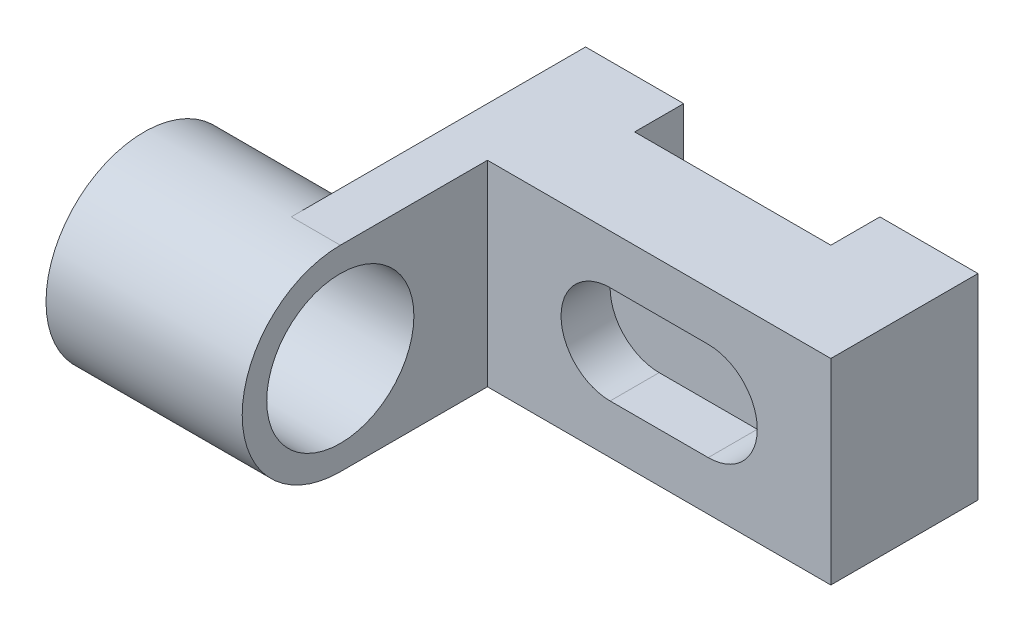
ISO-10303-21;
HEADER;
FILE_DESCRIPTION(('STEP AP214'),'2;1');
FILE_NAME('part.step','',(''),(''),'','','');
FILE_SCHEMA(('AUTOMOTIVE_DESIGN { 1 0 10303 214 1 1 1 1 }'));
ENDSEC;
DATA;
#1=APPLICATION_CONTEXT('core data for automotive mechanical design processes');
#2=APPLICATION_PROTOCOL_DEFINITION('international standard','automotive_design',2000,#1);
#3=PRODUCT_CONTEXT('',#1,'mechanical');
#4=PRODUCT('Part','Part','',(#3));
#5=PRODUCT_RELATED_PRODUCT_CATEGORY('part','',(#4));
#6=PRODUCT_DEFINITION_FORMATION('','',#4);
#7=PRODUCT_DEFINITION_CONTEXT('part definition',#1,'design');
#8=PRODUCT_DEFINITION('design','',#6,#7);
#9=PRODUCT_DEFINITION_SHAPE('','',#8);
#10=(LENGTH_UNIT() NAMED_UNIT(*) SI_UNIT(.MILLI.,.METRE.));
#11=(NAMED_UNIT(*) PLANE_ANGLE_UNIT() SI_UNIT($,.RADIAN.));
#12=(NAMED_UNIT(*) SI_UNIT($,.STERADIAN.) SOLID_ANGLE_UNIT());
#13=UNCERTAINTY_MEASURE_WITH_UNIT(LENGTH_MEASURE(1.E-05),#10,'distance_accuracy_value','');
#14=(GEOMETRIC_REPRESENTATION_CONTEXT(3) GLOBAL_UNCERTAINTY_ASSIGNED_CONTEXT((#13)) GLOBAL_UNIT_ASSIGNED_CONTEXT((#10,
#11,#12)) REPRESENTATION_CONTEXT('',''));
#15=CARTESIAN_POINT('',(0.,0.,0.));
#16=DIRECTION('',(0.,0.,1.));
#17=DIRECTION('',(1.,0.,0.));
#18=AXIS2_PLACEMENT_3D('',#15,#16,#17);
#19=CARTESIAN_POINT('',(-40.,20.,30.));
#20=DIRECTION('',(1.,0.,0.));
#21=DIRECTION('',(0.,0.,-1.));
#22=AXIS2_PLACEMENT_3D('',#19,#20,#21);
#23=PLANE('',#22);
#24=CARTESIAN_POINT('',(-40.,0.,60.));
#25=DIRECTION('',(-1.,0.,0.));
#26=DIRECTION('',(0.,0.,1.));
#27=AXIS2_PLACEMENT_3D('',#24,#25,#26);
#28=CIRCLE('',#27,20.);
#29=CARTESIAN_POINT('',(-40.,20.,60.));
#30=VERTEX_POINT('',#29);
#31=CARTESIAN_POINT('',(-40.,-20.,60.));
#32=VERTEX_POINT('',#31);
#33=EDGE_CURVE('E139',#30,#32,#28,.T.);
#34=ORIENTED_EDGE('',*,*,#33,.F.);
#35=DIRECTION('',(0.,0.,-1.));
#36=VECTOR('',#35,1.);
#37=CARTESIAN_POINT('',(-40.,20.,30.));
#38=LINE('',#37,#36);
#39=CARTESIAN_POINT('',(-40.,20.,0.));
#40=VERTEX_POINT('',#39);
#41=EDGE_CURVE('E147',#30,#40,#38,.T.);
#42=ORIENTED_EDGE('',*,*,#41,.T.);
#43=DIRECTION('',(0.,-1.,0.));
#44=VECTOR('',#43,1.);
#45=CARTESIAN_POINT('',(-40.,20.,0.));
#46=LINE('',#45,#44);
#47=CARTESIAN_POINT('',(-40.,-20.,0.));
#48=VERTEX_POINT('',#47);
#49=EDGE_CURVE('E246',#40,#48,#46,.T.);
#50=ORIENTED_EDGE('',*,*,#49,.T.);
#51=DIRECTION('',(0.,0.,-1.));
#52=VECTOR('',#51,1.);
#53=CARTESIAN_POINT('',(-40.,-20.,30.));
#54=LINE('',#53,#52);
#55=EDGE_CURVE('E157',#32,#48,#54,.T.);
#56=ORIENTED_EDGE('',*,*,#55,.F.);
#57=EDGE_LOOP('',(#34,#42,#50,#56));
#58=FACE_BOUND('',#57,.T.);
#59=ADVANCED_FACE('F33',(#58),#23,.F.);
#60=CARTESIAN_POINT('',(0.,0.,0.));
#61=DIRECTION('',(0.,0.,-1.));
#62=DIRECTION('',(-1.,0.,0.));
#63=AXIS2_PLACEMENT_3D('',#60,#61,#62);
#64=PLANE('',#63);
#65=DIRECTION('',(0.,1.,0.));
#66=VECTOR('',#65,1.);
#67=CARTESIAN_POINT('',(-20.,0.,0.));
#68=LINE('',#67,#66);
#69=CARTESIAN_POINT('',(-20.,-20.,0.));
#70=VERTEX_POINT('',#69);
#71=CARTESIAN_POINT('',(-20.,20.,0.));
#72=VERTEX_POINT('',#71);
#73=EDGE_CURVE('E11',#70,#72,#68,.T.);
#74=ORIENTED_EDGE('',*,*,#73,.F.);
#75=DIRECTION('',(-1.,0.,0.));
#76=VECTOR('',#75,1.);
#77=CARTESIAN_POINT('',(40.,-20.,0.));
#78=LINE('',#77,#76);
#79=EDGE_CURVE('E242',#70,#48,#78,.T.);
#80=ORIENTED_EDGE('',*,*,#79,.T.);
#81=ORIENTED_EDGE('',*,*,#49,.F.);
#82=DIRECTION('',(-1.,0.,0.));
#83=VECTOR('',#82,1.);
#84=CARTESIAN_POINT('',(40.,20.,0.));
#85=LINE('',#84,#83);
#86=EDGE_CURVE('E152',#72,#40,#85,.T.);
#87=ORIENTED_EDGE('',*,*,#86,.F.);
#88=EDGE_LOOP('',(#74,#80,#81,#87));
#89=FACE_BOUND('',#88,.T.);
#90=ADVANCED_FACE('F281',(#89),#64,.T.);
#91=CARTESIAN_POINT('',(40.,20.,30.));
#92=DIRECTION('',(1.,0.,0.));
#93=DIRECTION('',(0.,0.,-1.));
#94=AXIS2_PLACEMENT_3D('',#91,#92,#93);
#95=PLANE('',#94);
#96=DIRECTION('',(0.,-1.,0.));
#97=VECTOR('',#96,1.);
#98=CARTESIAN_POINT('',(40.,20.,0.));
#99=LINE('',#98,#97);
#100=CARTESIAN_POINT('',(40.,20.,0.));
#101=VERTEX_POINT('',#100);
#102=CARTESIAN_POINT('',(40.,-20.,0.));
#103=VERTEX_POINT('',#102);
#104=EDGE_CURVE('E226',#101,#103,#99,.T.);
#105=ORIENTED_EDGE('',*,*,#104,.F.);
#106=DIRECTION('',(0.,0.,-1.));
#107=VECTOR('',#106,1.);
#108=CARTESIAN_POINT('',(40.,20.,30.));
#109=LINE('',#108,#107);
#110=CARTESIAN_POINT('',(40.,20.,30.));
#111=VERTEX_POINT('',#110);
#112=EDGE_CURVE('E156',#111,#101,#109,.T.);
#113=ORIENTED_EDGE('',*,*,#112,.F.);
#114=DIRECTION('',(0.,-1.,0.));
#115=VECTOR('',#114,1.);
#116=CARTESIAN_POINT('',(40.,20.,30.));
#117=LINE('',#116,#115);
#118=CARTESIAN_POINT('',(40.,-20.,30.));
#119=VERTEX_POINT('',#118);
#120=EDGE_CURVE('E229',#111,#119,#117,.T.);
#121=ORIENTED_EDGE('',*,*,#120,.T.);
#122=DIRECTION('',(0.,0.,-1.));
#123=VECTOR('',#122,1.);
#124=CARTESIAN_POINT('',(40.,-20.,30.));
#125=LINE('',#124,#123);
#126=EDGE_CURVE('E239',#119,#103,#125,.T.);
#127=ORIENTED_EDGE('',*,*,#126,.T.);
#128=EDGE_LOOP('',(#105,#113,#121,#127));
#129=FACE_BOUND('',#128,.T.);
#130=ADVANCED_FACE('F35',(#129),#95,.T.);
#131=CARTESIAN_POINT('',(40.,20.,30.));
#132=DIRECTION('',(0.,-1.,0.));
#133=DIRECTION('',(1.,0.,0.));
#134=AXIS2_PLACEMENT_3D('',#131,#132,#133);
#135=PLANE('',#134);
#136=DIRECTION('',(-1.,0.,0.));
#137=VECTOR('',#136,1.);
#138=CARTESIAN_POINT('',(20.,20.,10.));
#139=LINE('',#138,#137);
#140=CARTESIAN_POINT('',(20.,20.,10.));
#141=VERTEX_POINT('',#140);
#142=CARTESIAN_POINT('',(-20.,20.,9.99999999999999));
#143=VERTEX_POINT('',#142);
#144=EDGE_CURVE('E216',#141,#143,#139,.T.);
#145=ORIENTED_EDGE('',*,*,#144,.T.);
#146=DIRECTION('',(0.,0.,-1.));
#147=VECTOR('',#146,1.);
#148=CARTESIAN_POINT('',(-20.,20.,9.99999999999999));
#149=LINE('',#148,#147);
#150=EDGE_CURVE('E210',#143,#72,#149,.T.);
#151=ORIENTED_EDGE('',*,*,#150,.T.);
#152=ORIENTED_EDGE('',*,*,#86,.T.);
#153=ORIENTED_EDGE('',*,*,#41,.F.);
#154=DIRECTION('',(-1.,0.,0.));
#155=VECTOR('',#154,1.);
#156=CARTESIAN_POINT('',(-30.,20.,60.));
#157=LINE('',#156,#155);
#158=CARTESIAN_POINT('',(-30.,20.,60.));
#159=VERTEX_POINT('',#158);
#160=EDGE_CURVE('E134',#159,#30,#157,.T.);
#161=ORIENTED_EDGE('',*,*,#160,.F.);
#162=DIRECTION('',(0.,0.,-1.));
#163=VECTOR('',#162,1.);
#164=CARTESIAN_POINT('',(-30.,20.,30.));
#165=LINE('',#164,#163);
#166=CARTESIAN_POINT('',(-30.,20.,30.));
#167=VERTEX_POINT('',#166);
#168=EDGE_CURVE('E176',#159,#167,#165,.T.);
#169=ORIENTED_EDGE('',*,*,#168,.T.);
#170=DIRECTION('',(-1.,0.,0.));
#171=VECTOR('',#170,1.);
#172=CARTESIAN_POINT('',(40.,20.,30.));
#173=LINE('',#172,#171);
#174=EDGE_CURVE('E236',#111,#167,#173,.T.);
#175=ORIENTED_EDGE('',*,*,#174,.F.);
#176=ORIENTED_EDGE('',*,*,#112,.T.);
#177=CARTESIAN_POINT('',(20.,20.,0.));
#178=VERTEX_POINT('',#177);
#179=EDGE_CURVE('E233',#101,#178,#85,.T.);
#180=ORIENTED_EDGE('',*,*,#179,.T.);
#181=DIRECTION('',(0.,0.,1.));
#182=VECTOR('',#181,1.);
#183=CARTESIAN_POINT('',(20.,20.,10.));
#184=LINE('',#183,#182);
#185=EDGE_CURVE('E212',#178,#141,#184,.T.);
#186=ORIENTED_EDGE('',*,*,#185,.T.);
#187=EDGE_LOOP('',(#145,#151,#152,#153,#161,#169,#175,#176,#180,#186));
#188=FACE_BOUND('',#187,.T.);
#189=ADVANCED_FACE('F149',(#188),#135,.F.);
#190=CARTESIAN_POINT('',(40.,-20.,30.));
#191=DIRECTION('',(0.,-1.,0.));
#192=DIRECTION('',(1.,0.,0.));
#193=AXIS2_PLACEMENT_3D('',#190,#191,#192);
#194=PLANE('',#193);
#195=DIRECTION('',(0.,0.,-1.));
#196=VECTOR('',#195,1.);
#197=CARTESIAN_POINT('',(-20.,-20.,9.99999999999999));
#198=LINE('',#197,#196);
#199=CARTESIAN_POINT('',(-20.,-20.,9.99999999999999));
#200=VERTEX_POINT('',#199);
#201=EDGE_CURVE('E204',#200,#70,#198,.T.);
#202=ORIENTED_EDGE('',*,*,#201,.F.);
#203=DIRECTION('',(-1.,0.,0.));
#204=VECTOR('',#203,1.);
#205=CARTESIAN_POINT('',(20.,-20.,10.));
#206=LINE('',#205,#204);
#207=CARTESIAN_POINT('',(20.,-20.,10.));
#208=VERTEX_POINT('',#207);
#209=EDGE_CURVE('E213',#208,#200,#206,.T.);
#210=ORIENTED_EDGE('',*,*,#209,.F.);
#211=DIRECTION('',(0.,0.,1.));
#212=VECTOR('',#211,1.);
#213=CARTESIAN_POINT('',(20.,-20.,10.));
#214=LINE('',#213,#212);
#215=CARTESIAN_POINT('',(20.,-20.,0.));
#216=VERTEX_POINT('',#215);
#217=EDGE_CURVE('E220',#216,#208,#214,.T.);
#218=ORIENTED_EDGE('',*,*,#217,.F.);
#219=EDGE_CURVE('E243',#103,#216,#78,.T.);
#220=ORIENTED_EDGE('',*,*,#219,.F.);
#221=ORIENTED_EDGE('',*,*,#126,.F.);
#222=DIRECTION('',(-1.,0.,0.));
#223=VECTOR('',#222,1.);
#224=CARTESIAN_POINT('',(40.,-20.,30.));
#225=LINE('',#224,#223);
#226=CARTESIAN_POINT('',(-30.,-20.,30.));
#227=VERTEX_POINT('',#226);
#228=EDGE_CURVE('E232',#119,#227,#225,.T.);
#229=ORIENTED_EDGE('',*,*,#228,.T.);
#230=DIRECTION('',(0.,0.,1.));
#231=VECTOR('',#230,1.);
#232=CARTESIAN_POINT('',(-30.,-20.,30.));
#233=LINE('',#232,#231);
#234=CARTESIAN_POINT('',(-30.,-20.,60.));
#235=VERTEX_POINT('',#234);
#236=EDGE_CURVE('E48',#227,#235,#233,.T.);
#237=ORIENTED_EDGE('',*,*,#236,.T.);
#238=DIRECTION('',(-1.,0.,0.));
#239=VECTOR('',#238,1.);
#240=CARTESIAN_POINT('',(-30.,-20.,60.));
#241=LINE('',#240,#239);
#242=EDGE_CURVE('E144',#235,#32,#241,.T.);
#243=ORIENTED_EDGE('',*,*,#242,.T.);
#244=ORIENTED_EDGE('',*,*,#55,.T.);
#245=ORIENTED_EDGE('',*,*,#79,.F.);
#246=EDGE_LOOP('',(#202,#210,#218,#220,#221,#229,#237,#243,#244,#245));
#247=FACE_BOUND('',#246,.T.);
#248=ADVANCED_FACE('F262',(#247),#194,.T.);
#249=CARTESIAN_POINT('',(0.,0.,30.));
#250=DIRECTION('',(0.,0.,-1.));
#251=DIRECTION('',(-1.,0.,0.));
#252=AXIS2_PLACEMENT_3D('',#249,#250,#251);
#253=PLANE('',#252);
#254=DIRECTION('',(-1.,0.,0.));
#255=VECTOR('',#254,1.);
#256=CARTESIAN_POINT('',(15.,10.,30.));
#257=LINE('',#256,#255);
#258=CARTESIAN_POINT('',(15.,10.,30.));
#259=VERTEX_POINT('',#258);
#260=CARTESIAN_POINT('',(-5.,10.,30.));
#261=VERTEX_POINT('',#260);
#262=EDGE_CURVE('E194',#259,#261,#257,.T.);
#263=ORIENTED_EDGE('',*,*,#262,.F.);
#264=CARTESIAN_POINT('',(15.,0.,30.));
#265=DIRECTION('',(0.,0.,1.));
#266=DIRECTION('',(1.,0.,0.));
#267=AXIS2_PLACEMENT_3D('',#264,#265,#266);
#268=CIRCLE('',#267,10.);
#269=CARTESIAN_POINT('',(15.,-10.,30.));
#270=VERTEX_POINT('',#269);
#271=EDGE_CURVE('E56',#270,#259,#268,.T.);
#272=ORIENTED_EDGE('',*,*,#271,.F.);
#273=DIRECTION('',(1.,0.,0.));
#274=VECTOR('',#273,1.);
#275=CARTESIAN_POINT('',(15.,-10.,30.));
#276=LINE('',#275,#274);
#277=CARTESIAN_POINT('',(-5.,-10.,30.));
#278=VERTEX_POINT('',#277);
#279=EDGE_CURVE('E183',#278,#270,#276,.T.);
#280=ORIENTED_EDGE('',*,*,#279,.F.);
#281=CARTESIAN_POINT('',(-5.,0.,30.));
#282=DIRECTION('',(0.,0.,1.));
#283=DIRECTION('',(1.,0.,0.));
#284=AXIS2_PLACEMENT_3D('',#281,#282,#283);
#285=CIRCLE('',#284,10.);
#286=EDGE_CURVE('E197',#261,#278,#285,.T.);
#287=ORIENTED_EDGE('',*,*,#286,.F.);
#288=EDGE_LOOP('',(#263,#272,#280,#287));
#289=FACE_BOUND('',#288,.T.);
#290=ORIENTED_EDGE('',*,*,#174,.T.);
#291=DIRECTION('',(0.,-1.,0.));
#292=VECTOR('',#291,1.);
#293=CARTESIAN_POINT('',(-30.,-20.,30.));
#294=LINE('',#293,#292);
#295=EDGE_CURVE('E172',#167,#227,#294,.T.);
#296=ORIENTED_EDGE('',*,*,#295,.T.);
#297=ORIENTED_EDGE('',*,*,#228,.F.);
#298=ORIENTED_EDGE('',*,*,#120,.F.);
#299=EDGE_LOOP('',(#290,#296,#297,#298));
#300=FACE_BOUND('',#299,.T.);
#301=ADVANCED_FACE('F270',(#289,#300),#253,.F.);
#302=DIRECTION('',(0.,-1.,0.));
#303=VECTOR('',#302,1.);
#304=CARTESIAN_POINT('',(20.,0.,0.));
#305=LINE('',#304,#303);
#306=EDGE_CURVE('E41',#178,#216,#305,.T.);
#307=ORIENTED_EDGE('',*,*,#306,.F.);
#308=ORIENTED_EDGE('',*,*,#179,.F.);
#309=ORIENTED_EDGE('',*,*,#104,.T.);
#310=ORIENTED_EDGE('',*,*,#219,.T.);
#311=EDGE_LOOP('',(#307,#308,#309,#310));
#312=FACE_BOUND('',#311,.T.);
#313=ADVANCED_FACE('F263',(#312),#64,.T.);
#314=CARTESIAN_POINT('',(-20.,20.,9.99999999999999));
#315=DIRECTION('',(-1.,0.,0.));
#316=DIRECTION('',(0.,0.,1.));
#317=AXIS2_PLACEMENT_3D('',#314,#315,#316);
#318=PLANE('',#317);
#319=ORIENTED_EDGE('',*,*,#73,.T.);
#320=ORIENTED_EDGE('',*,*,#150,.F.);
#321=DIRECTION('',(0.,-1.,0.));
#322=VECTOR('',#321,1.);
#323=CARTESIAN_POINT('',(-20.,20.,9.99999999999999));
#324=LINE('',#323,#322);
#325=EDGE_CURVE('E224',#143,#200,#324,.T.);
#326=ORIENTED_EDGE('',*,*,#325,.T.);
#327=ORIENTED_EDGE('',*,*,#201,.T.);
#328=EDGE_LOOP('',(#319,#320,#326,#327));
#329=FACE_BOUND('',#328,.T.);
#330=ADVANCED_FACE('F277',(#329),#318,.F.);
#331=CARTESIAN_POINT('',(20.,20.,10.));
#332=DIRECTION('',(0.,0.,1.));
#333=DIRECTION('',(1.,0.,0.));
#334=AXIS2_PLACEMENT_3D('',#331,#332,#333);
#335=PLANE('',#334);
#336=ORIENTED_EDGE('',*,*,#209,.T.);
#337=ORIENTED_EDGE('',*,*,#325,.F.);
#338=ORIENTED_EDGE('',*,*,#144,.F.);
#339=DIRECTION('',(0.,-1.,0.));
#340=VECTOR('',#339,1.);
#341=CARTESIAN_POINT('',(20.,20.,10.));
#342=LINE('',#341,#340);
#343=EDGE_CURVE('E218',#141,#208,#342,.T.);
#344=ORIENTED_EDGE('',*,*,#343,.T.);
#345=EDGE_LOOP('',(#336,#337,#338,#344));
#346=FACE_BOUND('',#345,.T.);
#347=ADVANCED_FACE('F275',(#346),#335,.F.);
#348=CARTESIAN_POINT('',(20.,20.,10.));
#349=DIRECTION('',(1.,0.,0.));
#350=DIRECTION('',(0.,0.,-1.));
#351=AXIS2_PLACEMENT_3D('',#348,#349,#350);
#352=PLANE('',#351);
#353=ORIENTED_EDGE('',*,*,#306,.T.);
#354=ORIENTED_EDGE('',*,*,#217,.T.);
#355=ORIENTED_EDGE('',*,*,#343,.F.);
#356=ORIENTED_EDGE('',*,*,#185,.F.);
#357=EDGE_LOOP('',(#353,#354,#355,#356));
#358=FACE_BOUND('',#357,.T.);
#359=ADVANCED_FACE('F255',(#358),#352,.F.);
#360=CARTESIAN_POINT('',(15.,0.,20.));
#361=DIRECTION('',(0.,0.,1.));
#362=DIRECTION('',(1.,0.,0.));
#363=AXIS2_PLACEMENT_3D('',#360,#361,#362);
#364=CYLINDRICAL_SURFACE('',#363,10.);
#365=ORIENTED_EDGE('',*,*,#271,.T.);
#366=DIRECTION('',(0.,0.,1.));
#367=VECTOR('',#366,1.);
#368=CARTESIAN_POINT('',(15.,10.,20.));
#369=LINE('',#368,#367);
#370=CARTESIAN_POINT('',(15.,10.,20.));
#371=VERTEX_POINT('',#370);
#372=EDGE_CURVE('E192',#371,#259,#369,.T.);
#373=ORIENTED_EDGE('',*,*,#372,.F.);
#374=CARTESIAN_POINT('',(15.,0.,20.));
#375=DIRECTION('',(0.,0.,1.));
#376=DIRECTION('',(1.,0.,0.));
#377=AXIS2_PLACEMENT_3D('',#374,#375,#376);
#378=CIRCLE('',#377,10.);
#379=CARTESIAN_POINT('',(15.,-10.,20.));
#380=VERTEX_POINT('',#379);
#381=EDGE_CURVE('E179',#380,#371,#378,.T.);
#382=ORIENTED_EDGE('',*,*,#381,.F.);
#383=DIRECTION('',(0.,0.,1.));
#384=VECTOR('',#383,1.);
#385=CARTESIAN_POINT('',(15.,-10.,20.));
#386=LINE('',#385,#384);
#387=EDGE_CURVE('E202',#380,#270,#386,.T.);
#388=ORIENTED_EDGE('',*,*,#387,.T.);
#389=EDGE_LOOP('',(#365,#373,#382,#388));
#390=FACE_BOUND('',#389,.T.);
#391=ADVANCED_FACE('F305',(#390),#364,.F.);
#392=CARTESIAN_POINT('',(15.,-10.,20.));
#393=DIRECTION('',(0.,-1.,0.));
#394=DIRECTION('',(0.,0.,-1.));
#395=AXIS2_PLACEMENT_3D('',#392,#393,#394);
#396=PLANE('',#395);
#397=ORIENTED_EDGE('',*,*,#279,.T.);
#398=ORIENTED_EDGE('',*,*,#387,.F.);
#399=DIRECTION('',(1.,0.,0.));
#400=VECTOR('',#399,1.);
#401=CARTESIAN_POINT('',(15.,-10.,20.));
#402=LINE('',#401,#400);
#403=CARTESIAN_POINT('',(-5.,-10.,20.));
#404=VERTEX_POINT('',#403);
#405=EDGE_CURVE('E189',#404,#380,#402,.T.);
#406=ORIENTED_EDGE('',*,*,#405,.F.);
#407=DIRECTION('',(0.,0.,1.));
#408=VECTOR('',#407,1.);
#409=CARTESIAN_POINT('',(-5.,-10.,20.));
#410=LINE('',#409,#408);
#411=EDGE_CURVE('E205',#404,#278,#410,.T.);
#412=ORIENTED_EDGE('',*,*,#411,.T.);
#413=EDGE_LOOP('',(#397,#398,#406,#412));
#414=FACE_BOUND('',#413,.T.);
#415=ADVANCED_FACE('F310',(#414),#396,.F.);
#416=CARTESIAN_POINT('',(-5.,0.,20.));
#417=DIRECTION('',(0.,0.,1.));
#418=DIRECTION('',(1.,0.,0.));
#419=AXIS2_PLACEMENT_3D('',#416,#417,#418);
#420=CYLINDRICAL_SURFACE('',#419,10.);
#421=ORIENTED_EDGE('',*,*,#286,.T.);
#422=ORIENTED_EDGE('',*,*,#411,.F.);
#423=CARTESIAN_POINT('',(-5.,0.,20.));
#424=DIRECTION('',(0.,0.,1.));
#425=DIRECTION('',(1.,0.,0.));
#426=AXIS2_PLACEMENT_3D('',#423,#424,#425);
#427=CIRCLE('',#426,10.);
#428=CARTESIAN_POINT('',(-5.,10.,20.));
#429=VERTEX_POINT('',#428);
#430=EDGE_CURVE('E186',#429,#404,#427,.T.);
#431=ORIENTED_EDGE('',*,*,#430,.F.);
#432=DIRECTION('',(0.,0.,1.));
#433=VECTOR('',#432,1.);
#434=CARTESIAN_POINT('',(-5.,10.,20.));
#435=LINE('',#434,#433);
#436=EDGE_CURVE('E207',#429,#261,#435,.T.);
#437=ORIENTED_EDGE('',*,*,#436,.T.);
#438=EDGE_LOOP('',(#421,#422,#431,#437));
#439=FACE_BOUND('',#438,.T.);
#440=ADVANCED_FACE('F315',(#439),#420,.F.);
#441=CARTESIAN_POINT('',(15.,10.,20.));
#442=DIRECTION('',(0.,1.,0.));
#443=DIRECTION('',(0.,0.,1.));
#444=AXIS2_PLACEMENT_3D('',#441,#442,#443);
#445=PLANE('',#444);
#446=ORIENTED_EDGE('',*,*,#262,.T.);
#447=ORIENTED_EDGE('',*,*,#436,.F.);
#448=DIRECTION('',(-1.,0.,0.));
#449=VECTOR('',#448,1.);
#450=CARTESIAN_POINT('',(15.,10.,20.));
#451=LINE('',#450,#449);
#452=EDGE_CURVE('E182',#371,#429,#451,.T.);
#453=ORIENTED_EDGE('',*,*,#452,.F.);
#454=ORIENTED_EDGE('',*,*,#372,.T.);
#455=EDGE_LOOP('',(#446,#447,#453,#454));
#456=FACE_BOUND('',#455,.T.);
#457=ADVANCED_FACE('F311',(#456),#445,.F.);
#458=CARTESIAN_POINT('',(15.,0.,20.));
#459=DIRECTION('',(0.,0.,1.));
#460=DIRECTION('',(1.,0.,0.));
#461=AXIS2_PLACEMENT_3D('',#458,#459,#460);
#462=PLANE('',#461);
#463=ORIENTED_EDGE('',*,*,#381,.T.);
#464=ORIENTED_EDGE('',*,*,#452,.T.);
#465=ORIENTED_EDGE('',*,*,#430,.T.);
#466=ORIENTED_EDGE('',*,*,#405,.T.);
#467=EDGE_LOOP('',(#463,#464,#465,#466));
#468=FACE_BOUND('',#467,.T.);
#469=ADVANCED_FACE('F314',(#468),#462,.T.);
#470=CARTESIAN_POINT('',(-30.,0.,60.));
#471=DIRECTION('',(-1.,0.,0.));
#472=DIRECTION('',(0.,0.,1.));
#473=AXIS2_PLACEMENT_3D('',#470,#471,#472);
#474=CYLINDRICAL_SURFACE('',#473,20.);
#475=ORIENTED_EDGE('',*,*,#160,.T.);
#476=ORIENTED_EDGE('',*,*,#33,.T.);
#477=ORIENTED_EDGE('',*,*,#242,.F.);
#478=CARTESIAN_POINT('',(-30.,0.,60.));
#479=DIRECTION('',(-1.,0.,0.));
#480=DIRECTION('',(0.,0.,1.));
#481=AXIS2_PLACEMENT_3D('',#478,#479,#480);
#482=CIRCLE('',#481,20.);
#483=EDGE_CURVE('E140',#235,#159,#482,.T.);
#484=ORIENTED_EDGE('',*,*,#483,.T.);
#485=EDGE_LOOP('',(#475,#476,#477,#484));
#486=FACE_BOUND('',#485,.T.);
#487=CARTESIAN_POINT('',(-70.,0.,60.));
#488=DIRECTION('',(-1.,0.,0.));
#489=DIRECTION('',(0.,0.,1.));
#490=AXIS2_PLACEMENT_3D('',#487,#488,#489);
#491=CIRCLE('',#490,20.);
#492=CARTESIAN_POINT('',(-70.,0.,80.));
#493=VERTEX_POINT('',#492);
#494=EDGE_CURVE('E161',#493,#493,#491,.T.);
#495=ORIENTED_EDGE('',*,*,#494,.F.);
#496=EDGE_LOOP('',(#495));
#497=FACE_BOUND('',#496,.T.);
#498=ADVANCED_FACE('F136',(#486,#497),#474,.T.);
#499=CARTESIAN_POINT('',(-30.,0.,60.));
#500=DIRECTION('',(-1.,0.,0.));
#501=DIRECTION('',(0.,0.,1.));
#502=AXIS2_PLACEMENT_3D('',#499,#500,#501);
#503=PLANE('',#502);
#504=CARTESIAN_POINT('',(-30.,0.,60.));
#505=DIRECTION('',(-1.,0.,0.));
#506=DIRECTION('',(0.,0.,1.));
#507=AXIS2_PLACEMENT_3D('',#504,#505,#506);
#508=CIRCLE('',#507,15.);
#509=CARTESIAN_POINT('',(-30.,0.,75.));
#510=VERTEX_POINT('',#509);
#511=EDGE_CURVE('E165',#510,#510,#508,.T.);
#512=ORIENTED_EDGE('',*,*,#511,.T.);
#513=EDGE_LOOP('',(#512));
#514=FACE_BOUND('',#513,.T.);
#515=ORIENTED_EDGE('',*,*,#295,.F.);
#516=ORIENTED_EDGE('',*,*,#168,.F.);
#517=ORIENTED_EDGE('',*,*,#483,.F.);
#518=ORIENTED_EDGE('',*,*,#236,.F.);
#519=EDGE_LOOP('',(#515,#516,#517,#518));
#520=FACE_BOUND('',#519,.T.);
#521=ADVANCED_FACE('F271',(#514,#520),#503,.F.);
#522=CARTESIAN_POINT('',(-30.,0.,60.));
#523=DIRECTION('',(-1.,0.,0.));
#524=DIRECTION('',(0.,0.,1.));
#525=AXIS2_PLACEMENT_3D('',#522,#523,#524);
#526=CYLINDRICAL_SURFACE('',#525,15.);
#527=ORIENTED_EDGE('',*,*,#511,.F.);
#528=EDGE_LOOP('',(#527));
#529=FACE_BOUND('',#528,.T.);
#530=CARTESIAN_POINT('',(-70.,0.,60.));
#531=DIRECTION('',(-1.,0.,0.));
#532=DIRECTION('',(0.,0.,1.));
#533=AXIS2_PLACEMENT_3D('',#530,#531,#532);
#534=CIRCLE('',#533,15.);
#535=CARTESIAN_POINT('',(-70.,0.,75.));
#536=VERTEX_POINT('',#535);
#537=EDGE_CURVE('E162',#536,#536,#534,.T.);
#538=ORIENTED_EDGE('',*,*,#537,.T.);
#539=EDGE_LOOP('',(#538));
#540=FACE_BOUND('',#539,.T.);
#541=ADVANCED_FACE('F330',(#529,#540),#526,.F.);
#542=CARTESIAN_POINT('',(-70.,0.,60.));
#543=DIRECTION('',(-1.,0.,0.));
#544=DIRECTION('',(0.,0.,1.));
#545=AXIS2_PLACEMENT_3D('',#542,#543,#544);
#546=PLANE('',#545);
#547=ORIENTED_EDGE('',*,*,#494,.T.);
#548=EDGE_LOOP('',(#547));
#549=FACE_BOUND('',#548,.T.);
#550=ORIENTED_EDGE('',*,*,#537,.F.);
#551=EDGE_LOOP('',(#550));
#552=FACE_BOUND('',#551,.T.);
#553=ADVANCED_FACE('F334',(#549,#552),#546,.T.);
#554=CLOSED_SHELL('',(#59,#90,#130,#189,#248,#301,#313,#330,#347,#359,#391,#415,#440,#457,#469,
#498,#521,#541,#553));
#555=MANIFOLD_SOLID_BREP('B2',#554);
#556=ADVANCED_BREP_SHAPE_REPRESENTATION('',(#18,#555),#14);
#557=SHAPE_DEFINITION_REPRESENTATION(#9,#556);
ENDSEC;
END-ISO-10303-21;
